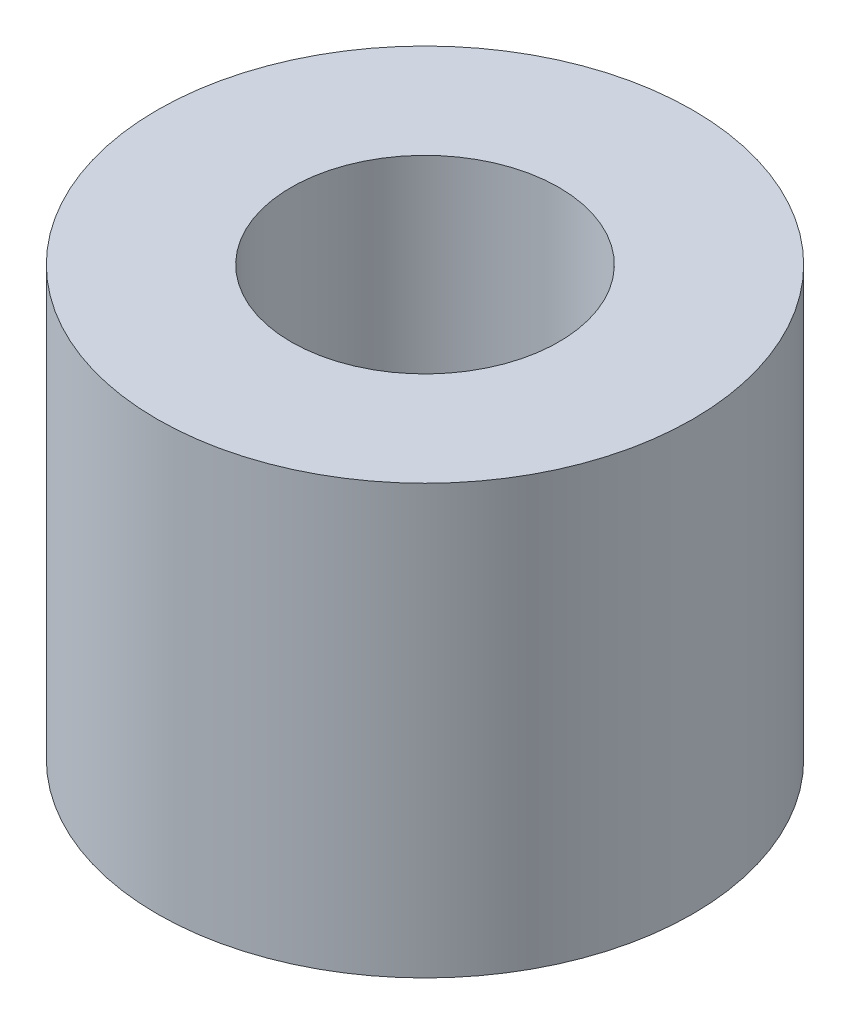
ISO-10303-21;
HEADER;
FILE_DESCRIPTION(('STEP AP214'),'2;1');
FILE_NAME('part.step','',(''),(''),'','','');
FILE_SCHEMA(('AUTOMOTIVE_DESIGN { 1 0 10303 214 1 1 1 1 }'));
ENDSEC;
DATA;
#1=APPLICATION_CONTEXT('core data for automotive mechanical design processes');
#2=APPLICATION_PROTOCOL_DEFINITION('international standard','automotive_design',2000,#1);
#3=PRODUCT_CONTEXT('',#1,'mechanical');
#4=PRODUCT('Part','Part','',(#3));
#5=PRODUCT_RELATED_PRODUCT_CATEGORY('part','',(#4));
#6=PRODUCT_DEFINITION_FORMATION('','',#4);
#7=PRODUCT_DEFINITION_CONTEXT('part definition',#1,'design');
#8=PRODUCT_DEFINITION('design','',#6,#7);
#9=PRODUCT_DEFINITION_SHAPE('','',#8);
#10=(LENGTH_UNIT() NAMED_UNIT(*) SI_UNIT(.MILLI.,.METRE.));
#11=(NAMED_UNIT(*) PLANE_ANGLE_UNIT() SI_UNIT($,.RADIAN.));
#12=(NAMED_UNIT(*) SI_UNIT($,.STERADIAN.) SOLID_ANGLE_UNIT());
#13=UNCERTAINTY_MEASURE_WITH_UNIT(LENGTH_MEASURE(1.E-05),#10,'distance_accuracy_value','');
#14=(GEOMETRIC_REPRESENTATION_CONTEXT(3) GLOBAL_UNCERTAINTY_ASSIGNED_CONTEXT((#13)) GLOBAL_UNIT_ASSIGNED_CONTEXT((#10,
#11,#12)) REPRESENTATION_CONTEXT('',''));
#15=CARTESIAN_POINT('',(0.,0.,0.));
#16=DIRECTION('',(0.,0.,1.));
#17=DIRECTION('',(1.,0.,0.));
#18=AXIS2_PLACEMENT_3D('',#15,#16,#17);
#19=CARTESIAN_POINT('',(0.,4.,0.));
#20=DIRECTION('',(0.,-1.,0.));
#21=DIRECTION('',(0.,0.,-1.));
#22=AXIS2_PLACEMENT_3D('',#19,#20,#21);
#23=CYLINDRICAL_SURFACE('',#22,2.5);
#24=CARTESIAN_POINT('',(0.,4.,0.));
#25=DIRECTION('',(0.,1.,0.));
#26=DIRECTION('',(0.,0.,1.));
#27=AXIS2_PLACEMENT_3D('',#24,#25,#26);
#28=CIRCLE('',#27,2.5);
#29=CARTESIAN_POINT('',(0.,4.,2.5));
#30=VERTEX_POINT('',#29);
#31=EDGE_CURVE('E10',#30,#30,#28,.T.);
#32=ORIENTED_EDGE('',*,*,#31,.F.);
#33=EDGE_LOOP('',(#32));
#34=FACE_BOUND('',#33,.T.);
#35=CARTESIAN_POINT('',(0.,0.,0.));
#36=DIRECTION('',(0.,1.,0.));
#37=DIRECTION('',(0.,0.,1.));
#38=AXIS2_PLACEMENT_3D('',#35,#36,#37);
#39=CIRCLE('',#38,2.5);
#40=CARTESIAN_POINT('',(0.,0.,2.5));
#41=VERTEX_POINT('',#40);
#42=EDGE_CURVE('E37',#41,#41,#39,.T.);
#43=ORIENTED_EDGE('',*,*,#42,.T.);
#44=EDGE_LOOP('',(#43));
#45=FACE_BOUND('',#44,.T.);
#46=ADVANCED_FACE('F34',(#34,#45),#23,.T.);
#47=CARTESIAN_POINT('',(0.,4.,0.));
#48=DIRECTION('',(0.,1.,0.));
#49=DIRECTION('',(0.,0.,1.));
#50=AXIS2_PLACEMENT_3D('',#47,#48,#49);
#51=PLANE('',#50);
#52=CARTESIAN_POINT('',(0.,4.,0.));
#53=DIRECTION('',(0.,1.,0.));
#54=DIRECTION('',(0.,0.,1.));
#55=AXIS2_PLACEMENT_3D('',#52,#53,#54);
#56=CIRCLE('',#55,1.24999999999999);
#57=CARTESIAN_POINT('',(0.,4.,1.24999999999999));
#58=VERTEX_POINT('',#57);
#59=EDGE_CURVE('E48',#58,#58,#56,.T.);
#60=ORIENTED_EDGE('',*,*,#59,.F.);
#61=EDGE_LOOP('',(#60));
#62=FACE_BOUND('',#61,.T.);
#63=ORIENTED_EDGE('',*,*,#31,.T.);
#64=EDGE_LOOP('',(#63));
#65=FACE_BOUND('',#64,.T.);
#66=ADVANCED_FACE('F54',(#62,#65),#51,.T.);
#67=CARTESIAN_POINT('',(0.,0.,0.));
#68=DIRECTION('',(0.,1.,0.));
#69=DIRECTION('',(0.,0.,1.));
#70=AXIS2_PLACEMENT_3D('',#67,#68,#69);
#71=PLANE('',#70);
#72=CARTESIAN_POINT('',(0.,0.,0.));
#73=DIRECTION('',(0.,1.,0.));
#74=DIRECTION('',(0.,0.,1.));
#75=AXIS2_PLACEMENT_3D('',#72,#73,#74);
#76=CIRCLE('',#75,1.25);
#77=CARTESIAN_POINT('',(0.,0.,1.25));
#78=VERTEX_POINT('',#77);
#79=EDGE_CURVE('E44',#78,#78,#76,.T.);
#80=ORIENTED_EDGE('',*,*,#79,.T.);
#81=EDGE_LOOP('',(#80));
#82=FACE_BOUND('',#81,.T.);
#83=ORIENTED_EDGE('',*,*,#42,.F.);
#84=EDGE_LOOP('',(#83));
#85=FACE_BOUND('',#84,.T.);
#86=ADVANCED_FACE('F56',(#82,#85),#71,.F.);
#87=CARTESIAN_POINT('',(0.,4.,0.));
#88=DIRECTION('',(0.,1.,0.));
#89=DIRECTION('',(0.,0.,1.));
#90=AXIS2_PLACEMENT_3D('',#87,#88,#89);
#91=CYLINDRICAL_SURFACE('',#90,1.24999999999999);
#92=ORIENTED_EDGE('',*,*,#79,.F.);
#93=EDGE_LOOP('',(#92));
#94=FACE_BOUND('',#93,.T.);
#95=ORIENTED_EDGE('',*,*,#59,.T.);
#96=EDGE_LOOP('',(#95));
#97=FACE_BOUND('',#96,.T.);
#98=ADVANCED_FACE('F52',(#94,#97),#91,.F.);
#99=CLOSED_SHELL('',(#46,#66,#86,#98));
#100=MANIFOLD_SOLID_BREP('B2',#99);
#101=ADVANCED_BREP_SHAPE_REPRESENTATION('',(#18,#100),#14);
#102=SHAPE_DEFINITION_REPRESENTATION(#9,#101);
ENDSEC;
END-ISO-10303-21;
